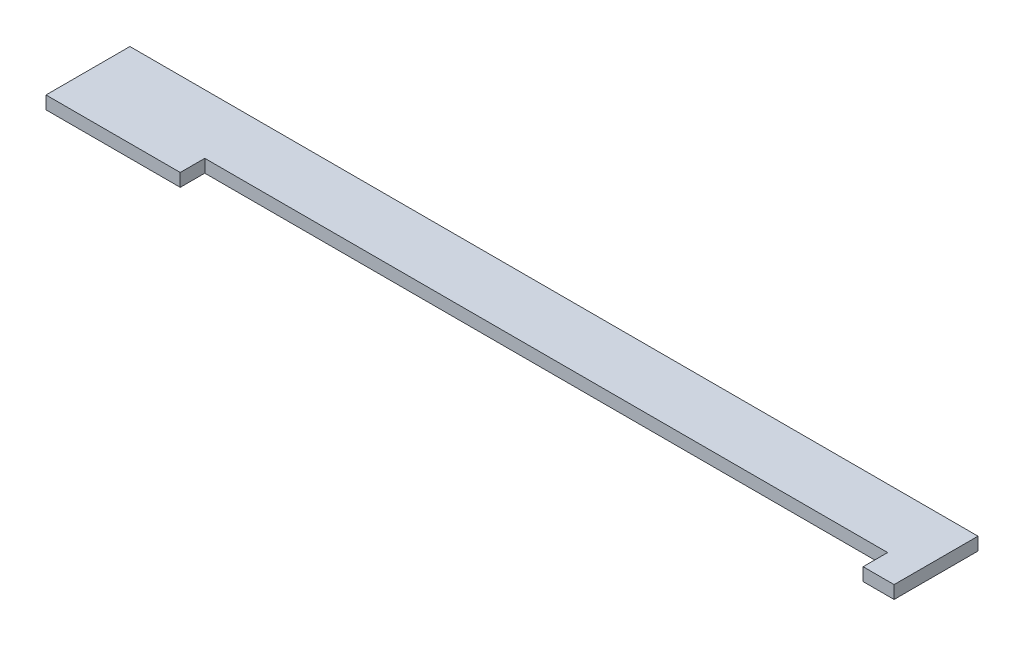
ISO-10303-21;
HEADER;
FILE_DESCRIPTION(('STEP AP214'),'2;1');
FILE_NAME('part.step','',(''),(''),'','','');
FILE_SCHEMA(('AUTOMOTIVE_DESIGN { 1 0 10303 214 1 1 1 1 }'));
ENDSEC;
DATA;
#1=APPLICATION_CONTEXT('core data for automotive mechanical design processes');
#2=APPLICATION_PROTOCOL_DEFINITION('international standard','automotive_design',2000,#1);
#3=PRODUCT_CONTEXT('',#1,'mechanical');
#4=PRODUCT('Part','Part','',(#3));
#5=PRODUCT_RELATED_PRODUCT_CATEGORY('part','',(#4));
#6=PRODUCT_DEFINITION_FORMATION('','',#4);
#7=PRODUCT_DEFINITION_CONTEXT('part definition',#1,'design');
#8=PRODUCT_DEFINITION('design','',#6,#7);
#9=PRODUCT_DEFINITION_SHAPE('','',#8);
#10=(LENGTH_UNIT() NAMED_UNIT(*) SI_UNIT(.MILLI.,.METRE.));
#11=(NAMED_UNIT(*) PLANE_ANGLE_UNIT() SI_UNIT($,.RADIAN.));
#12=(NAMED_UNIT(*) SI_UNIT($,.STERADIAN.) SOLID_ANGLE_UNIT());
#13=UNCERTAINTY_MEASURE_WITH_UNIT(LENGTH_MEASURE(1.E-05),#10,'distance_accuracy_value','');
#14=(GEOMETRIC_REPRESENTATION_CONTEXT(3) GLOBAL_UNCERTAINTY_ASSIGNED_CONTEXT((#13)) GLOBAL_UNIT_ASSIGNED_CONTEXT((#10,
#11,#12)) REPRESENTATION_CONTEXT('',''));
#15=CARTESIAN_POINT('',(0.,0.,0.));
#16=DIRECTION('',(0.,0.,1.));
#17=DIRECTION('',(1.,0.,0.));
#18=AXIS2_PLACEMENT_3D('',#15,#16,#17);
#19=CARTESIAN_POINT('',(594.803541607587,10.,-37.3691275167786));
#20=DIRECTION('',(0.,0.,1.));
#21=DIRECTION('',(1.,0.,0.));
#22=AXIS2_PLACEMENT_3D('',#19,#20,#21);
#23=PLANE('',#22);
#24=DIRECTION('',(-1.,0.,0.));
#25=VECTOR('',#24,1.);
#26=CARTESIAN_POINT('',(594.803541607587,0.,-37.3691275167786));
#27=LINE('',#26,#25);
#28=CARTESIAN_POINT('',(594.803541607587,0.,-37.3691275167786));
#29=VERTEX_POINT('',#28);
#30=CARTESIAN_POINT('',(-62.1964583924126,0.,-37.3691275167785));
#31=VERTEX_POINT('',#30);
#32=EDGE_CURVE('E132',#29,#31,#27,.T.);
#33=ORIENTED_EDGE('',*,*,#32,.T.);
#34=DIRECTION('',(0.,-1.,0.));
#35=VECTOR('',#34,1.);
#36=CARTESIAN_POINT('',(-62.1964583924126,10.,-37.3691275167785));
#37=LINE('',#36,#35);
#38=CARTESIAN_POINT('',(-62.1964583924126,10.,-37.3691275167785));
#39=VERTEX_POINT('',#38);
#40=EDGE_CURVE('E11',#39,#31,#37,.T.);
#41=ORIENTED_EDGE('',*,*,#40,.F.);
#42=DIRECTION('',(-1.,0.,0.));
#43=VECTOR('',#42,1.);
#44=CARTESIAN_POINT('',(594.803541607587,10.,-37.3691275167786));
#45=LINE('',#44,#43);
#46=CARTESIAN_POINT('',(594.803541607587,10.,-37.3691275167786));
#47=VERTEX_POINT('',#46);
#48=EDGE_CURVE('E146',#47,#39,#45,.T.);
#49=ORIENTED_EDGE('',*,*,#48,.F.);
#50=DIRECTION('',(0.,-1.,0.));
#51=VECTOR('',#50,1.);
#52=CARTESIAN_POINT('',(594.803541607587,10.,-37.3691275167786));
#53=LINE('',#52,#51);
#54=EDGE_CURVE('E128',#47,#29,#53,.T.);
#55=ORIENTED_EDGE('',*,*,#54,.T.);
#56=EDGE_LOOP('',(#33,#41,#49,#55));
#57=FACE_BOUND('',#56,.T.);
#58=ADVANCED_FACE('F36',(#57),#23,.F.);
#59=CARTESIAN_POINT('',(-62.1964583924126,10.,-37.3691275167785));
#60=DIRECTION('',(1.,0.,0.));
#61=DIRECTION('',(0.,0.,-1.));
#62=AXIS2_PLACEMENT_3D('',#59,#60,#61);
#63=PLANE('',#62);
#64=DIRECTION('',(0.,0.,1.));
#65=VECTOR('',#64,1.);
#66=CARTESIAN_POINT('',(-62.1964583924126,0.,-37.3691275167785));
#67=LINE('',#66,#65);
#68=CARTESIAN_POINT('',(-62.1964583924126,0.,27.6308724832215));
#69=VERTEX_POINT('',#68);
#70=EDGE_CURVE('E135',#31,#69,#67,.T.);
#71=ORIENTED_EDGE('',*,*,#70,.T.);
#72=DIRECTION('',(0.,-1.,0.));
#73=VECTOR('',#72,1.);
#74=CARTESIAN_POINT('',(-62.1964583924126,10.,27.6308724832215));
#75=LINE('',#74,#73);
#76=CARTESIAN_POINT('',(-62.1964583924126,10.,27.6308724832215));
#77=VERTEX_POINT('',#76);
#78=EDGE_CURVE('E44',#77,#69,#75,.T.);
#79=ORIENTED_EDGE('',*,*,#78,.F.);
#80=DIRECTION('',(0.,0.,1.));
#81=VECTOR('',#80,1.);
#82=CARTESIAN_POINT('',(-62.1964583924126,10.,-37.3691275167785));
#83=LINE('',#82,#81);
#84=EDGE_CURVE('E95',#39,#77,#83,.T.);
#85=ORIENTED_EDGE('',*,*,#84,.F.);
#86=ORIENTED_EDGE('',*,*,#40,.T.);
#87=EDGE_LOOP('',(#71,#79,#85,#86));
#88=FACE_BOUND('',#87,.T.);
#89=ADVANCED_FACE('F181',(#88),#63,.F.);
#90=CARTESIAN_POINT('',(-62.1964583924126,10.,27.6308724832215));
#91=DIRECTION('',(0.,0.,-1.));
#92=DIRECTION('',(-1.,0.,0.));
#93=AXIS2_PLACEMENT_3D('',#90,#91,#92);
#94=PLANE('',#93);
#95=DIRECTION('',(1.,0.,0.));
#96=VECTOR('',#95,1.);
#97=CARTESIAN_POINT('',(-62.1964583924126,0.,27.6308724832215));
#98=LINE('',#97,#96);
#99=CARTESIAN_POINT('',(41.8035416075874,0.,27.6308724832215));
#100=VERTEX_POINT('',#99);
#101=EDGE_CURVE('E137',#69,#100,#98,.T.);
#102=ORIENTED_EDGE('',*,*,#101,.T.);
#103=DIRECTION('',(0.,-1.,0.));
#104=VECTOR('',#103,1.);
#105=CARTESIAN_POINT('',(41.8035416075874,10.,27.6308724832215));
#106=LINE('',#105,#104);
#107=CARTESIAN_POINT('',(41.8035416075874,10.,27.6308724832215));
#108=VERTEX_POINT('',#107);
#109=EDGE_CURVE('E153',#108,#100,#106,.T.);
#110=ORIENTED_EDGE('',*,*,#109,.F.);
#111=DIRECTION('',(1.,0.,0.));
#112=VECTOR('',#111,1.);
#113=CARTESIAN_POINT('',(-62.1964583924126,10.,27.6308724832215));
#114=LINE('',#113,#112);
#115=EDGE_CURVE('E161',#77,#108,#114,.T.);
#116=ORIENTED_EDGE('',*,*,#115,.F.);
#117=ORIENTED_EDGE('',*,*,#78,.T.);
#118=EDGE_LOOP('',(#102,#110,#116,#117));
#119=FACE_BOUND('',#118,.T.);
#120=ADVANCED_FACE('F159',(#119),#94,.F.);
#121=CARTESIAN_POINT('',(41.8035416075874,10.,27.6308724832215));
#122=DIRECTION('',(-1.,0.,0.));
#123=DIRECTION('',(0.,0.,1.));
#124=AXIS2_PLACEMENT_3D('',#121,#122,#123);
#125=PLANE('',#124);
#126=DIRECTION('',(0.,0.,-1.));
#127=VECTOR('',#126,1.);
#128=CARTESIAN_POINT('',(41.8035416075874,0.,27.6308724832215));
#129=LINE('',#128,#127);
#130=CARTESIAN_POINT('',(41.8035416075874,0.,8.63087248322147));
#131=VERTEX_POINT('',#130);
#132=EDGE_CURVE('E139',#100,#131,#129,.T.);
#133=ORIENTED_EDGE('',*,*,#132,.T.);
#134=DIRECTION('',(0.,-1.,0.));
#135=VECTOR('',#134,1.);
#136=CARTESIAN_POINT('',(41.8035416075874,10.,8.63087248322147));
#137=LINE('',#136,#135);
#138=CARTESIAN_POINT('',(41.8035416075874,10.,8.63087248322147));
#139=VERTEX_POINT('',#138);
#140=EDGE_CURVE('E150',#139,#131,#137,.T.);
#141=ORIENTED_EDGE('',*,*,#140,.F.);
#142=DIRECTION('',(0.,0.,-1.));
#143=VECTOR('',#142,1.);
#144=CARTESIAN_POINT('',(41.8035416075874,10.,27.6308724832215));
#145=LINE('',#144,#143);
#146=EDGE_CURVE('E173',#108,#139,#145,.T.);
#147=ORIENTED_EDGE('',*,*,#146,.F.);
#148=ORIENTED_EDGE('',*,*,#109,.T.);
#149=EDGE_LOOP('',(#133,#141,#147,#148));
#150=FACE_BOUND('',#149,.T.);
#151=ADVANCED_FACE('F169',(#150),#125,.F.);
#152=CARTESIAN_POINT('',(41.8035416075874,10.,8.63087248322147));
#153=DIRECTION('',(0.,0.,-1.));
#154=DIRECTION('',(-1.,0.,0.));
#155=AXIS2_PLACEMENT_3D('',#152,#153,#154);
#156=PLANE('',#155);
#157=DIRECTION('',(1.,0.,0.));
#158=VECTOR('',#157,1.);
#159=CARTESIAN_POINT('',(41.8035416075874,0.,8.63087248322147));
#160=LINE('',#159,#158);
#161=CARTESIAN_POINT('',(570.803541607587,0.,8.63087248322147));
#162=VERTEX_POINT('',#161);
#163=EDGE_CURVE('E141',#131,#162,#160,.T.);
#164=ORIENTED_EDGE('',*,*,#163,.T.);
#165=DIRECTION('',(0.,-1.,0.));
#166=VECTOR('',#165,1.);
#167=CARTESIAN_POINT('',(570.803541607587,10.,8.63087248322147));
#168=LINE('',#167,#166);
#169=CARTESIAN_POINT('',(570.803541607587,10.,8.63087248322147));
#170=VERTEX_POINT('',#169);
#171=EDGE_CURVE('E123',#170,#162,#168,.T.);
#172=ORIENTED_EDGE('',*,*,#171,.F.);
#173=DIRECTION('',(1.,0.,0.));
#174=VECTOR('',#173,1.);
#175=CARTESIAN_POINT('',(41.8035416075874,10.,8.63087248322147));
#176=LINE('',#175,#174);
#177=EDGE_CURVE('E114',#139,#170,#176,.T.);
#178=ORIENTED_EDGE('',*,*,#177,.F.);
#179=ORIENTED_EDGE('',*,*,#140,.T.);
#180=EDGE_LOOP('',(#164,#172,#178,#179));
#181=FACE_BOUND('',#180,.T.);
#182=ADVANCED_FACE('F172',(#181),#156,.F.);
#183=CARTESIAN_POINT('',(570.803541607587,10.,8.63087248322147));
#184=DIRECTION('',(1.,0.,0.));
#185=DIRECTION('',(0.,0.,-1.));
#186=AXIS2_PLACEMENT_3D('',#183,#184,#185);
#187=PLANE('',#186);
#188=DIRECTION('',(0.,0.,1.));
#189=VECTOR('',#188,1.);
#190=CARTESIAN_POINT('',(570.803541607587,0.,8.63087248322147));
#191=LINE('',#190,#189);
#192=CARTESIAN_POINT('',(570.803541607587,0.,27.6308724832215));
#193=VERTEX_POINT('',#192);
#194=EDGE_CURVE('E122',#162,#193,#191,.T.);
#195=ORIENTED_EDGE('',*,*,#194,.T.);
#196=DIRECTION('',(0.,-1.,0.));
#197=VECTOR('',#196,1.);
#198=CARTESIAN_POINT('',(570.803541607587,10.,27.6308724832215));
#199=LINE('',#198,#197);
#200=CARTESIAN_POINT('',(570.803541607587,10.,27.6308724832215));
#201=VERTEX_POINT('',#200);
#202=EDGE_CURVE('E119',#201,#193,#199,.T.);
#203=ORIENTED_EDGE('',*,*,#202,.F.);
#204=DIRECTION('',(0.,0.,1.));
#205=VECTOR('',#204,1.);
#206=CARTESIAN_POINT('',(570.803541607587,10.,8.63087248322147));
#207=LINE('',#206,#205);
#208=EDGE_CURVE('E108',#170,#201,#207,.T.);
#209=ORIENTED_EDGE('',*,*,#208,.F.);
#210=ORIENTED_EDGE('',*,*,#171,.T.);
#211=EDGE_LOOP('',(#195,#203,#209,#210));
#212=FACE_BOUND('',#211,.T.);
#213=ADVANCED_FACE('F120',(#212),#187,.F.);
#214=CARTESIAN_POINT('',(570.803541607587,10.,27.6308724832215));
#215=DIRECTION('',(0.,0.,-1.));
#216=DIRECTION('',(-1.,0.,0.));
#217=AXIS2_PLACEMENT_3D('',#214,#215,#216);
#218=PLANE('',#217);
#219=DIRECTION('',(1.,0.,0.));
#220=VECTOR('',#219,1.);
#221=CARTESIAN_POINT('',(570.803541607587,0.,27.6308724832215));
#222=LINE('',#221,#220);
#223=CARTESIAN_POINT('',(594.803541607587,0.,27.6308724832215));
#224=VERTEX_POINT('',#223);
#225=EDGE_CURVE('E81',#193,#224,#222,.T.);
#226=ORIENTED_EDGE('',*,*,#225,.T.);
#227=DIRECTION('',(0.,-1.,0.));
#228=VECTOR('',#227,1.);
#229=CARTESIAN_POINT('',(594.803541607587,10.,27.6308724832215));
#230=LINE('',#229,#228);
#231=CARTESIAN_POINT('',(594.803541607587,10.,27.6308724832215));
#232=VERTEX_POINT('',#231);
#233=EDGE_CURVE('E124',#232,#224,#230,.T.);
#234=ORIENTED_EDGE('',*,*,#233,.F.);
#235=DIRECTION('',(1.,0.,0.));
#236=VECTOR('',#235,1.);
#237=CARTESIAN_POINT('',(570.803541607587,10.,27.6308724832215));
#238=LINE('',#237,#236);
#239=EDGE_CURVE('E112',#201,#232,#238,.T.);
#240=ORIENTED_EDGE('',*,*,#239,.F.);
#241=ORIENTED_EDGE('',*,*,#202,.T.);
#242=EDGE_LOOP('',(#226,#234,#240,#241));
#243=FACE_BOUND('',#242,.T.);
#244=ADVANCED_FACE('F126',(#243),#218,.F.);
#245=CARTESIAN_POINT('',(594.803541607587,10.,27.6308724832215));
#246=DIRECTION('',(-1.,0.,0.));
#247=DIRECTION('',(0.,0.,1.));
#248=AXIS2_PLACEMENT_3D('',#245,#246,#247);
#249=PLANE('',#248);
#250=DIRECTION('',(0.,0.,-1.));
#251=VECTOR('',#250,1.);
#252=CARTESIAN_POINT('',(594.803541607587,0.,27.6308724832215));
#253=LINE('',#252,#251);
#254=EDGE_CURVE('E87',#224,#29,#253,.T.);
#255=ORIENTED_EDGE('',*,*,#254,.T.);
#256=ORIENTED_EDGE('',*,*,#54,.F.);
#257=DIRECTION('',(0.,0.,-1.));
#258=VECTOR('',#257,1.);
#259=CARTESIAN_POINT('',(594.803541607587,10.,27.6308724832215));
#260=LINE('',#259,#258);
#261=EDGE_CURVE('E52',#232,#47,#260,.T.);
#262=ORIENTED_EDGE('',*,*,#261,.F.);
#263=ORIENTED_EDGE('',*,*,#233,.T.);
#264=EDGE_LOOP('',(#255,#256,#262,#263));
#265=FACE_BOUND('',#264,.T.);
#266=ADVANCED_FACE('F197',(#265),#249,.F.);
#267=CARTESIAN_POINT('',(0.,10.,0.));
#268=DIRECTION('',(0.,1.,0.));
#269=DIRECTION('',(0.,0.,1.));
#270=AXIS2_PLACEMENT_3D('',#267,#268,#269);
#271=PLANE('',#270);
#272=ORIENTED_EDGE('',*,*,#48,.T.);
#273=ORIENTED_EDGE('',*,*,#84,.T.);
#274=ORIENTED_EDGE('',*,*,#115,.T.);
#275=ORIENTED_EDGE('',*,*,#146,.T.);
#276=ORIENTED_EDGE('',*,*,#177,.T.);
#277=ORIENTED_EDGE('',*,*,#208,.T.);
#278=ORIENTED_EDGE('',*,*,#239,.T.);
#279=ORIENTED_EDGE('',*,*,#261,.T.);
#280=EDGE_LOOP('',(#272,#273,#274,#275,#276,#277,#278,#279));
#281=FACE_BOUND('',#280,.T.);
#282=ADVANCED_FACE('F110',(#281),#271,.T.);
#283=CARTESIAN_POINT('',(0.,0.,0.));
#284=DIRECTION('',(0.,1.,0.));
#285=DIRECTION('',(0.,0.,1.));
#286=AXIS2_PLACEMENT_3D('',#283,#284,#285);
#287=PLANE('',#286);
#288=ORIENTED_EDGE('',*,*,#32,.F.);
#289=ORIENTED_EDGE('',*,*,#254,.F.);
#290=ORIENTED_EDGE('',*,*,#225,.F.);
#291=ORIENTED_EDGE('',*,*,#194,.F.);
#292=ORIENTED_EDGE('',*,*,#163,.F.);
#293=ORIENTED_EDGE('',*,*,#132,.F.);
#294=ORIENTED_EDGE('',*,*,#101,.F.);
#295=ORIENTED_EDGE('',*,*,#70,.F.);
#296=EDGE_LOOP('',(#288,#289,#290,#291,#292,#293,#294,#295));
#297=FACE_BOUND('',#296,.T.);
#298=ADVANCED_FACE('F165',(#297),#287,.F.);
#299=CLOSED_SHELL('',(#58,#89,#120,#151,#182,#213,#244,#266,#282,#298));
#300=MANIFOLD_SOLID_BREP('B2',#299);
#301=ADVANCED_BREP_SHAPE_REPRESENTATION('',(#18,#300),#14);
#302=SHAPE_DEFINITION_REPRESENTATION(#9,#301);
ENDSEC;
END-ISO-10303-21;
